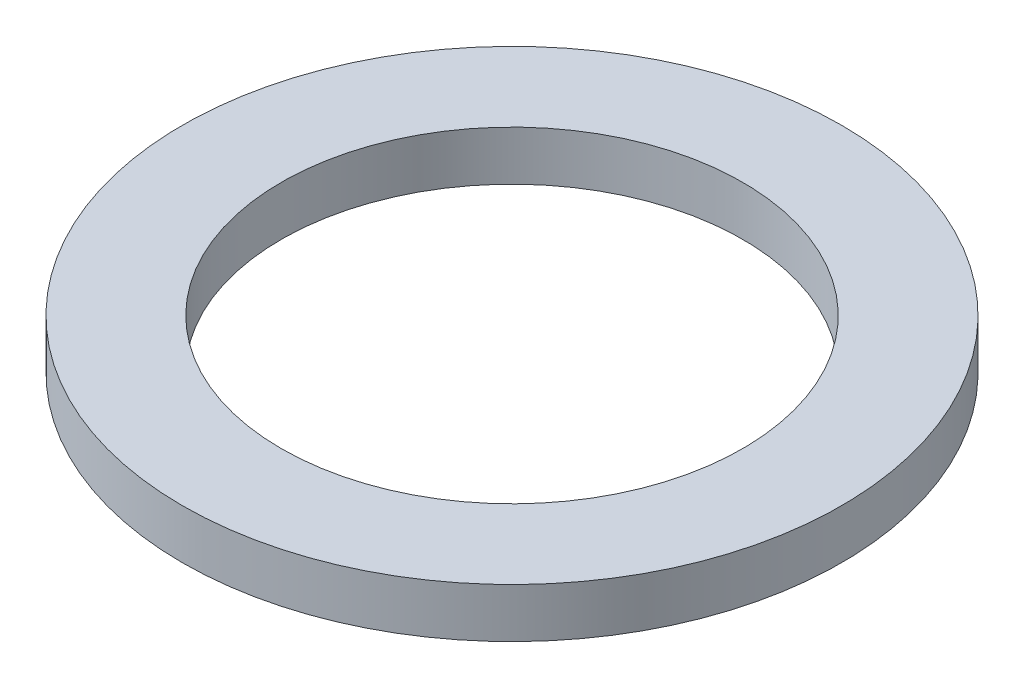
ISO-10303-21;
HEADER;
FILE_DESCRIPTION(('STEP AP214'),'2;1');
FILE_NAME('part.step','',(''),(''),'','','');
FILE_SCHEMA(('AUTOMOTIVE_DESIGN { 1 0 10303 214 1 1 1 1 }'));
ENDSEC;
DATA;
#1=APPLICATION_CONTEXT('core data for automotive mechanical design processes');
#2=APPLICATION_PROTOCOL_DEFINITION('international standard','automotive_design',2000,#1);
#3=PRODUCT_CONTEXT('',#1,'mechanical');
#4=PRODUCT('Part','Part','',(#3));
#5=PRODUCT_RELATED_PRODUCT_CATEGORY('part','',(#4));
#6=PRODUCT_DEFINITION_FORMATION('','',#4);
#7=PRODUCT_DEFINITION_CONTEXT('part definition',#1,'design');
#8=PRODUCT_DEFINITION('design','',#6,#7);
#9=PRODUCT_DEFINITION_SHAPE('','',#8);
#10=(LENGTH_UNIT() NAMED_UNIT(*) SI_UNIT(.MILLI.,.METRE.));
#11=(NAMED_UNIT(*) PLANE_ANGLE_UNIT() SI_UNIT($,.RADIAN.));
#12=(NAMED_UNIT(*) SI_UNIT($,.STERADIAN.) SOLID_ANGLE_UNIT());
#13=UNCERTAINTY_MEASURE_WITH_UNIT(LENGTH_MEASURE(1.E-05),#10,'distance_accuracy_value','');
#14=(GEOMETRIC_REPRESENTATION_CONTEXT(3) GLOBAL_UNCERTAINTY_ASSIGNED_CONTEXT((#13)) GLOBAL_UNIT_ASSIGNED_CONTEXT((#10,
#11,#12)) REPRESENTATION_CONTEXT('',''));
#15=CARTESIAN_POINT('',(0.,0.,0.));
#16=DIRECTION('',(0.,0.,1.));
#17=DIRECTION('',(1.,0.,0.));
#18=AXIS2_PLACEMENT_3D('',#15,#16,#17);
#19=CARTESIAN_POINT('',(0.,3.,0.));
#20=DIRECTION('',(0.,-1.,0.));
#21=DIRECTION('',(0.,0.,-1.));
#22=AXIS2_PLACEMENT_3D('',#19,#20,#21);
#23=CYLINDRICAL_SURFACE('',#22,20.);
#24=CARTESIAN_POINT('',(0.,3.,0.));
#25=DIRECTION('',(0.,1.,0.));
#26=DIRECTION('',(0.,0.,1.));
#27=AXIS2_PLACEMENT_3D('',#24,#25,#26);
#28=CIRCLE('',#27,20.);
#29=CARTESIAN_POINT('',(0.,3.,20.));
#30=VERTEX_POINT('',#29);
#31=EDGE_CURVE('E10',#30,#30,#28,.T.);
#32=ORIENTED_EDGE('',*,*,#31,.F.);
#33=EDGE_LOOP('',(#32));
#34=FACE_BOUND('',#33,.T.);
#35=CARTESIAN_POINT('',(0.,0.,0.));
#36=DIRECTION('',(0.,1.,0.));
#37=DIRECTION('',(0.,0.,1.));
#38=AXIS2_PLACEMENT_3D('',#35,#36,#37);
#39=CIRCLE('',#38,20.);
#40=CARTESIAN_POINT('',(0.,0.,20.));
#41=VERTEX_POINT('',#40);
#42=EDGE_CURVE('E34',#41,#41,#39,.T.);
#43=ORIENTED_EDGE('',*,*,#42,.T.);
#44=EDGE_LOOP('',(#43));
#45=FACE_BOUND('',#44,.T.);
#46=ADVANCED_FACE('F31',(#34,#45),#23,.T.);
#47=CARTESIAN_POINT('',(0.,3.,0.));
#48=DIRECTION('',(0.,1.,0.));
#49=DIRECTION('',(0.,0.,1.));
#50=AXIS2_PLACEMENT_3D('',#47,#48,#49);
#51=PLANE('',#50);
#52=CARTESIAN_POINT('',(0.,3.,0.));
#53=DIRECTION('',(0.,1.,0.));
#54=DIRECTION('',(0.,0.,1.));
#55=AXIS2_PLACEMENT_3D('',#52,#53,#54);
#56=CIRCLE('',#55,14.);
#57=CARTESIAN_POINT('',(0.,3.,14.));
#58=VERTEX_POINT('',#57);
#59=EDGE_CURVE('E43',#58,#58,#56,.T.);
#60=ORIENTED_EDGE('',*,*,#59,.F.);
#61=EDGE_LOOP('',(#60));
#62=FACE_BOUND('',#61,.T.);
#63=ORIENTED_EDGE('',*,*,#31,.T.);
#64=EDGE_LOOP('',(#63));
#65=FACE_BOUND('',#64,.T.);
#66=ADVANCED_FACE('F58',(#62,#65),#51,.T.);
#67=CARTESIAN_POINT('',(0.,0.,0.));
#68=DIRECTION('',(0.,1.,0.));
#69=DIRECTION('',(0.,0.,1.));
#70=AXIS2_PLACEMENT_3D('',#67,#68,#69);
#71=PLANE('',#70);
#72=CARTESIAN_POINT('',(0.,0.,0.));
#73=DIRECTION('',(0.,1.,0.));
#74=DIRECTION('',(0.,0.,1.));
#75=AXIS2_PLACEMENT_3D('',#72,#73,#74);
#76=CIRCLE('',#75,14.);
#77=CARTESIAN_POINT('',(0.,0.,14.));
#78=VERTEX_POINT('',#77);
#79=EDGE_CURVE('E41',#78,#78,#76,.T.);
#80=ORIENTED_EDGE('',*,*,#79,.T.);
#81=EDGE_LOOP('',(#80));
#82=FACE_BOUND('',#81,.T.);
#83=ORIENTED_EDGE('',*,*,#42,.F.);
#84=EDGE_LOOP('',(#83));
#85=FACE_BOUND('',#84,.T.);
#86=ADVANCED_FACE('F49',(#82,#85),#71,.F.);
#87=CARTESIAN_POINT('',(0.,0.,0.));
#88=DIRECTION('',(0.,1.,0.));
#89=DIRECTION('',(0.,0.,1.));
#90=AXIS2_PLACEMENT_3D('',#87,#88,#89);
#91=CYLINDRICAL_SURFACE('',#90,14.);
#92=ORIENTED_EDGE('',*,*,#79,.F.);
#93=EDGE_LOOP('',(#92));
#94=FACE_BOUND('',#93,.T.);
#95=ORIENTED_EDGE('',*,*,#59,.T.);
#96=EDGE_LOOP('',(#95));
#97=FACE_BOUND('',#96,.T.);
#98=ADVANCED_FACE('F52',(#94,#97),#91,.F.);
#99=CLOSED_SHELL('',(#46,#66,#86,#98));
#100=MANIFOLD_SOLID_BREP('B2',#99);
#101=ADVANCED_BREP_SHAPE_REPRESENTATION('',(#18,#100),#14);
#102=SHAPE_DEFINITION_REPRESENTATION(#9,#101);
ENDSEC;
END-ISO-10303-21;
